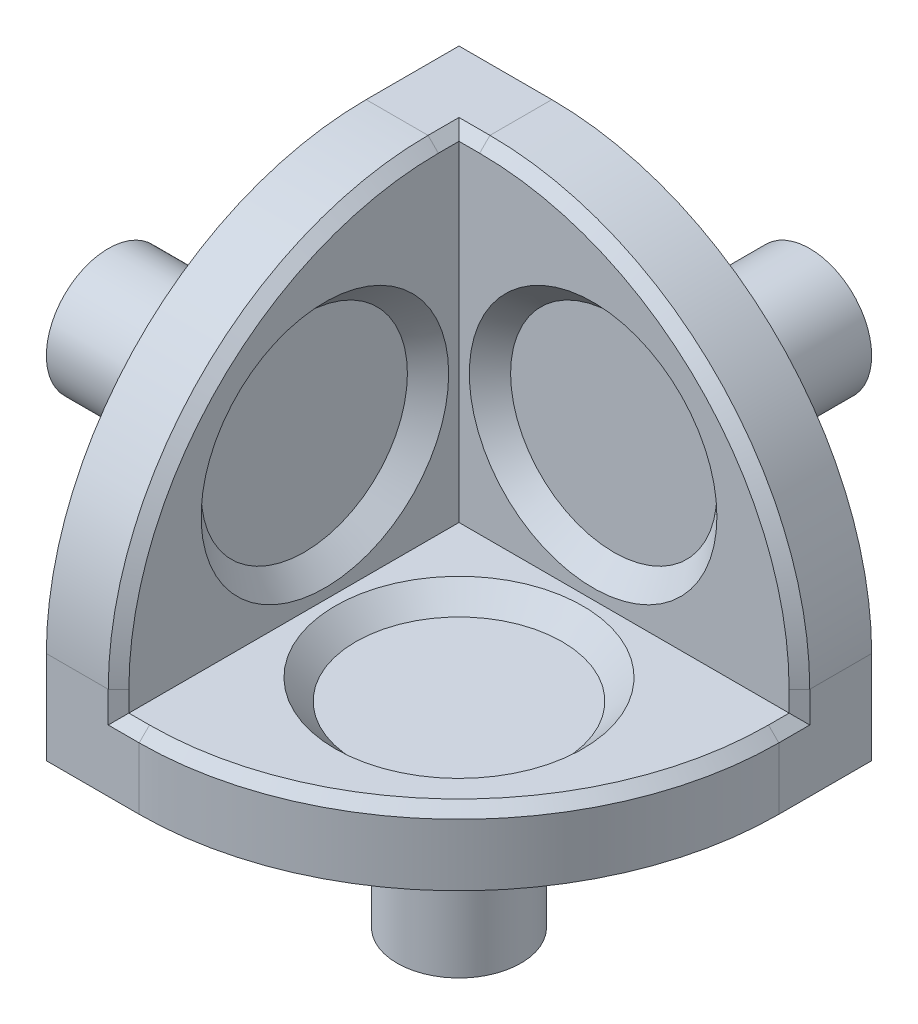
ISO-10303-21;
HEADER;
FILE_DESCRIPTION(('STEP AP214'),'2;1');
FILE_NAME('part.step','',(''),(''),'','','');
FILE_SCHEMA(('AUTOMOTIVE_DESIGN { 1 0 10303 214 1 1 1 1 }'));
ENDSEC;
DATA;
#1=APPLICATION_CONTEXT('core data for automotive mechanical design processes');
#2=APPLICATION_PROTOCOL_DEFINITION('international standard','automotive_design',2000,#1);
#3=PRODUCT_CONTEXT('',#1,'mechanical');
#4=PRODUCT('Part','Part','',(#3));
#5=PRODUCT_RELATED_PRODUCT_CATEGORY('part','',(#4));
#6=PRODUCT_DEFINITION_FORMATION('','',#4);
#7=PRODUCT_DEFINITION_CONTEXT('part definition',#1,'design');
#8=PRODUCT_DEFINITION('design','',#6,#7);
#9=PRODUCT_DEFINITION_SHAPE('','',#8);
#10=(LENGTH_UNIT() NAMED_UNIT(*) SI_UNIT(.MILLI.,.METRE.));
#11=(NAMED_UNIT(*) PLANE_ANGLE_UNIT() SI_UNIT($,.RADIAN.));
#12=(NAMED_UNIT(*) SI_UNIT($,.STERADIAN.) SOLID_ANGLE_UNIT());
#13=UNCERTAINTY_MEASURE_WITH_UNIT(LENGTH_MEASURE(1.E-05),#10,'distance_accuracy_value','');
#14=(GEOMETRIC_REPRESENTATION_CONTEXT(3) GLOBAL_UNCERTAINTY_ASSIGNED_CONTEXT((#13)) GLOBAL_UNIT_ASSIGNED_CONTEXT((#10,
#11,#12)) REPRESENTATION_CONTEXT('',''));
#15=CARTESIAN_POINT('',(0.,0.,0.));
#16=DIRECTION('',(0.,0.,1.));
#17=DIRECTION('',(1.,0.,0.));
#18=AXIS2_PLACEMENT_3D('',#15,#16,#17);
#19=CARTESIAN_POINT('',(10.,2.5,10.));
#20=DIRECTION('',(0.,1.,0.));
#21=DIRECTION('',(0.,0.,1.));
#22=AXIS2_PLACEMENT_3D('',#19,#20,#21);
#23=PLANE('',#22);
#24=CARTESIAN_POINT('',(10.,2.49999999994088,10.));
#25=DIRECTION('',(0.,1.,0.));
#26=DIRECTION('',(0.,0.,1.));
#27=AXIS2_PLACEMENT_3D('',#24,#25,#26);
#28=CIRCLE('',#27,4.9999999999719);
#29=CARTESIAN_POINT('',(10.,2.49999999994088,14.9999999999719));
#30=VERTEX_POINT('',#29);
#31=EDGE_CURVE('E19',#30,#30,#28,.T.);
#32=ORIENTED_EDGE('',*,*,#31,.T.);
#33=EDGE_LOOP('',(#32));
#34=FACE_BOUND('',#33,.T.);
#35=ADVANCED_FACE('F15',(#34),#23,.T.);
#36=CARTESIAN_POINT('',(10.,10.,2.5));
#37=DIRECTION('',(0.,0.,1.));
#38=DIRECTION('',(1.,0.,0.));
#39=AXIS2_PLACEMENT_3D('',#36,#37,#38);
#40=PLANE('',#39);
#41=CARTESIAN_POINT('',(10.,10.,2.50000000005457));
#42=DIRECTION('',(0.,0.,1.));
#43=DIRECTION('',(1.,0.,0.));
#44=AXIS2_PLACEMENT_3D('',#41,#42,#43);
#45=CIRCLE('',#44,4.99999999998636);
#46=CARTESIAN_POINT('',(14.9999999999864,10.,2.50000000005457));
#47=VERTEX_POINT('',#46);
#48=EDGE_CURVE('E345',#47,#47,#45,.T.);
#49=ORIENTED_EDGE('',*,*,#48,.T.);
#50=EDGE_LOOP('',(#49));
#51=FACE_BOUND('',#50,.T.);
#52=ADVANCED_FACE('F593',(#51),#40,.T.);
#53=CARTESIAN_POINT('',(10.,10.,-7.));
#54=DIRECTION('',(0.,0.,1.));
#55=DIRECTION('',(1.,0.,0.));
#56=AXIS2_PLACEMENT_3D('',#53,#54,#55);
#57=PLANE('',#56);
#58=CARTESIAN_POINT('',(10.,10.,-7.));
#59=DIRECTION('',(0.,0.,1.));
#60=DIRECTION('',(1.,0.,0.));
#61=AXIS2_PLACEMENT_3D('',#58,#59,#60);
#62=CIRCLE('',#61,3.);
#63=CARTESIAN_POINT('',(13.,10.,-7.));
#64=VERTEX_POINT('',#63);
#65=EDGE_CURVE('E343',#64,#64,#62,.T.);
#66=ORIENTED_EDGE('',*,*,#65,.F.);
#67=EDGE_LOOP('',(#66));
#68=FACE_BOUND('',#67,.T.);
#69=ADVANCED_FACE('F367',(#68),#57,.F.);
#70=CARTESIAN_POINT('',(10.,-7.,10.));
#71=DIRECTION('',(0.,1.,0.));
#72=DIRECTION('',(0.,0.,1.));
#73=AXIS2_PLACEMENT_3D('',#70,#71,#72);
#74=PLANE('',#73);
#75=CARTESIAN_POINT('',(10.,-7.,10.));
#76=DIRECTION('',(0.,1.,0.));
#77=DIRECTION('',(0.,0.,1.));
#78=AXIS2_PLACEMENT_3D('',#75,#76,#77);
#79=CIRCLE('',#78,3.);
#80=CARTESIAN_POINT('',(10.,-7.,13.));
#81=VERTEX_POINT('',#80);
#82=EDGE_CURVE('E340',#81,#81,#79,.T.);
#83=ORIENTED_EDGE('',*,*,#82,.F.);
#84=EDGE_LOOP('',(#83));
#85=FACE_BOUND('',#84,.T.);
#86=ADVANCED_FACE('F356',(#85),#74,.F.);
#87=CARTESIAN_POINT('',(10.,3.49999999997408,10.));
#88=DIRECTION('',(0.,1.,0.));
#89=DIRECTION('',(0.,0.,1.));
#90=AXIS2_PLACEMENT_3D('',#87,#88,#89);
#91=CONICAL_SURFACE('',#90,5.99999999997979,0.785398163384793);
#92=CARTESIAN_POINT('',(10.,3.49999999997408,10.));
#93=DIRECTION('',(0.,1.,0.));
#94=DIRECTION('',(0.,0.,1.));
#95=AXIS2_PLACEMENT_3D('',#92,#93,#94);
#96=CIRCLE('',#95,5.99999999997979);
#97=CARTESIAN_POINT('',(10.,3.49999999997408,15.9999999999798));
#98=VERTEX_POINT('',#97);
#99=EDGE_CURVE('E337',#98,#98,#96,.F.);
#100=ORIENTED_EDGE('',*,*,#99,.F.);
#101=EDGE_LOOP('',(#100));
#102=FACE_BOUND('',#101,.T.);
#103=ORIENTED_EDGE('',*,*,#31,.F.);
#104=EDGE_LOOP('',(#103));
#105=FACE_BOUND('',#104,.T.);
#106=ADVANCED_FACE('F353',(#102,#105),#91,.F.);
#107=CARTESIAN_POINT('',(2.5,10.,10.));
#108=DIRECTION('',(1.,0.,0.));
#109=DIRECTION('',(0.,0.,-1.));
#110=AXIS2_PLACEMENT_3D('',#107,#108,#109);
#111=PLANE('',#110);
#112=CARTESIAN_POINT('',(2.50000000005457,10.,10.));
#113=DIRECTION('',(1.,0.,0.));
#114=DIRECTION('',(0.,0.,-1.));
#115=AXIS2_PLACEMENT_3D('',#112,#113,#114);
#116=CIRCLE('',#115,4.99999999998636);
#117=CARTESIAN_POINT('',(2.50000000005457,10.,5.00000000001364));
#118=VERTEX_POINT('',#117);
#119=EDGE_CURVE('E334',#118,#118,#116,.T.);
#120=ORIENTED_EDGE('',*,*,#119,.T.);
#121=EDGE_LOOP('',(#120));
#122=FACE_BOUND('',#121,.T.);
#123=ADVANCED_FACE('F355',(#122),#111,.T.);
#124=CARTESIAN_POINT('',(10.,10.,3.49999999991724));
#125=DIRECTION('',(0.,0.,1.));
#126=DIRECTION('',(1.,0.,0.));
#127=AXIS2_PLACEMENT_3D('',#124,#125,#126);
#128=CONICAL_SURFACE('',#127,5.99999999984902,0.785398163397448);
#129=CARTESIAN_POINT('',(10.,10.,3.49999999997408));
#130=DIRECTION('',(0.,0.,1.));
#131=DIRECTION('',(1.,0.,0.));
#132=AXIS2_PLACEMENT_3D('',#129,#130,#131);
#133=CIRCLE('',#132,5.99999999990587);
#134=CARTESIAN_POINT('',(15.9999999999059,10.,3.49999999997408));
#135=VERTEX_POINT('',#134);
#136=EDGE_CURVE('E294',#135,#135,#133,.F.);
#137=ORIENTED_EDGE('',*,*,#136,.F.);
#138=EDGE_LOOP('',(#137));
#139=FACE_BOUND('',#138,.T.);
#140=ORIENTED_EDGE('',*,*,#48,.F.);
#141=EDGE_LOOP('',(#140));
#142=FACE_BOUND('',#141,.T.);
#143=ADVANCED_FACE('F364',(#139,#142),#128,.F.);
#144=CARTESIAN_POINT('',(10.,10.,-7.475));
#145=DIRECTION('',(0.,0.,1.));
#146=DIRECTION('',(1.,0.,0.));
#147=AXIS2_PLACEMENT_3D('',#144,#145,#146);
#148=CYLINDRICAL_SURFACE('',#147,3.);
#149=ORIENTED_EDGE('',*,*,#65,.T.);
#150=EDGE_LOOP('',(#149));
#151=FACE_BOUND('',#150,.T.);
#152=CARTESIAN_POINT('',(10.,10.,0.500000000101863));
#153=DIRECTION('',(0.,0.,1.));
#154=DIRECTION('',(0.,1.,0.));
#155=AXIS2_PLACEMENT_3D('',#152,#153,#154);
#156=CIRCLE('',#155,2.99999999997681);
#157=CARTESIAN_POINT('',(10.,12.9999999999768,0.500000000101863));
#158=VERTEX_POINT('',#157);
#159=EDGE_CURVE('E284',#158,#158,#156,.T.);
#160=ORIENTED_EDGE('',*,*,#159,.F.);
#161=EDGE_LOOP('',(#160));
#162=FACE_BOUND('',#161,.T.);
#163=ADVANCED_FACE('F681',(#151,#162),#148,.T.);
#164=CARTESIAN_POINT('',(10.,-7.475,10.));
#165=DIRECTION('',(0.,1.,0.));
#166=DIRECTION('',(0.,0.,1.));
#167=AXIS2_PLACEMENT_3D('',#164,#165,#166);
#168=CYLINDRICAL_SURFACE('',#167,3.);
#169=ORIENTED_EDGE('',*,*,#82,.T.);
#170=EDGE_LOOP('',(#169));
#171=FACE_BOUND('',#170,.T.);
#172=CARTESIAN_POINT('',(10.,0.500000000101863,10.));
#173=DIRECTION('',(0.,1.,0.));
#174=DIRECTION('',(1.,0.,0.));
#175=AXIS2_PLACEMENT_3D('',#172,#173,#174);
#176=CIRCLE('',#175,2.99999999997681);
#177=CARTESIAN_POINT('',(12.9999999999768,0.500000000101863,10.));
#178=VERTEX_POINT('',#177);
#179=EDGE_CURVE('E262',#178,#178,#176,.T.);
#180=ORIENTED_EDGE('',*,*,#179,.F.);
#181=EDGE_LOOP('',(#180));
#182=FACE_BOUND('',#181,.T.);
#183=ADVANCED_FACE('F686',(#171,#182),#168,.T.);
#184=CARTESIAN_POINT('',(0.,3.5,0.));
#185=DIRECTION('',(0.,1.,0.));
#186=DIRECTION('',(0.,0.,1.));
#187=AXIS2_PLACEMENT_3D('',#184,#185,#186);
#188=PLANE('',#187);
#189=ORIENTED_EDGE('',*,*,#99,.T.);
#190=EDGE_LOOP('',(#189));
#191=FACE_BOUND('',#190,.T.);
#192=DIRECTION('',(1.,0.,0.));
#193=VECTOR('',#192,1.);
#194=CARTESIAN_POINT('',(3.5,3.5,3.5));
#195=LINE('',#194,#193);
#196=CARTESIAN_POINT('',(3.5,3.5,3.5));
#197=VERTEX_POINT('',#196);
#198=CARTESIAN_POINT('',(19.5,3.5,3.5));
#199=VERTEX_POINT('',#198);
#200=EDGE_CURVE('E95',#197,#199,#195,.T.);
#201=ORIENTED_EDGE('',*,*,#200,.F.);
#202=DIRECTION('',(0.,0.,-1.));
#203=VECTOR('',#202,1.);
#204=CARTESIAN_POINT('',(3.5,3.5,20.));
#205=LINE('',#204,#203);
#206=CARTESIAN_POINT('',(3.5,3.5,19.5));
#207=VERTEX_POINT('',#206);
#208=EDGE_CURVE('E256',#207,#197,#205,.T.);
#209=ORIENTED_EDGE('',*,*,#208,.F.);
#210=DIRECTION('',(1.,0.,0.));
#211=VECTOR('',#210,1.);
#212=CARTESIAN_POINT('',(0.,3.5,19.5));
#213=LINE('',#212,#211);
#214=CARTESIAN_POINT('',(4.5,3.50000000000004,19.5));
#215=VERTEX_POINT('',#214);
#216=EDGE_CURVE('E102',#207,#215,#213,.T.);
#217=ORIENTED_EDGE('',*,*,#216,.T.);
#218=CARTESIAN_POINT('',(4.5,3.50000000000004,4.5));
#219=DIRECTION('',(0.,-1.,0.));
#220=DIRECTION('',(0.,0.,-1.));
#221=AXIS2_PLACEMENT_3D('',#218,#219,#220);
#222=CIRCLE('',#221,15.);
#223=CARTESIAN_POINT('',(19.5,3.50000000000004,4.5));
#224=VERTEX_POINT('',#223);
#225=EDGE_CURVE('E266',#224,#215,#222,.T.);
#226=ORIENTED_EDGE('',*,*,#225,.F.);
#227=DIRECTION('',(0.,0.,1.));
#228=VECTOR('',#227,1.);
#229=CARTESIAN_POINT('',(19.5,3.5,4.5));
#230=LINE('',#229,#228);
#231=EDGE_CURVE('E79',#224,#199,#230,.F.);
#232=ORIENTED_EDGE('',*,*,#231,.T.);
#233=EDGE_LOOP('',(#201,#209,#217,#226,#232));
#234=FACE_BOUND('',#233,.T.);
#235=ADVANCED_FACE('F441',(#191,#234),#188,.T.);
#236=CARTESIAN_POINT('',(3.49999999991724,10.,10.));
#237=DIRECTION('',(1.,0.,0.));
#238=DIRECTION('',(0.,0.,-1.));
#239=AXIS2_PLACEMENT_3D('',#236,#237,#238);
#240=CONICAL_SURFACE('',#239,5.99999999984902,0.785398163397448);
#241=CARTESIAN_POINT('',(3.49999999997408,10.,10.));
#242=DIRECTION('',(1.,0.,0.));
#243=DIRECTION('',(0.,0.,-1.));
#244=AXIS2_PLACEMENT_3D('',#241,#242,#243);
#245=CIRCLE('',#244,5.99999999990587);
#246=CARTESIAN_POINT('',(3.49999999997408,10.,4.00000000009413));
#247=VERTEX_POINT('',#246);
#248=EDGE_CURVE('E245',#247,#247,#245,.F.);
#249=ORIENTED_EDGE('',*,*,#248,.F.);
#250=EDGE_LOOP('',(#249));
#251=FACE_BOUND('',#250,.T.);
#252=ORIENTED_EDGE('',*,*,#119,.F.);
#253=EDGE_LOOP('',(#252));
#254=FACE_BOUND('',#253,.T.);
#255=ADVANCED_FACE('F515',(#251,#254),#240,.F.);
#256=CARTESIAN_POINT('',(3.5,0.,3.5));
#257=DIRECTION('',(0.,0.,1.));
#258=DIRECTION('',(1.,0.,0.));
#259=AXIS2_PLACEMENT_3D('',#256,#257,#258);
#260=PLANE('',#259);
#261=ORIENTED_EDGE('',*,*,#136,.T.);
#262=EDGE_LOOP('',(#261));
#263=FACE_BOUND('',#262,.T.);
#264=DIRECTION('',(0.,1.,0.));
#265=VECTOR('',#264,1.);
#266=CARTESIAN_POINT('',(3.5,0.,3.5));
#267=LINE('',#266,#265);
#268=CARTESIAN_POINT('',(3.5,19.5,3.5));
#269=VERTEX_POINT('',#268);
#270=EDGE_CURVE('E287',#197,#269,#267,.T.);
#271=ORIENTED_EDGE('',*,*,#270,.F.);
#272=ORIENTED_EDGE('',*,*,#200,.T.);
#273=DIRECTION('',(0.,1.,0.));
#274=VECTOR('',#273,1.);
#275=CARTESIAN_POINT('',(19.5,3.5,3.5));
#276=LINE('',#275,#274);
#277=CARTESIAN_POINT('',(19.5,4.5,3.50000000000004));
#278=VERTEX_POINT('',#277);
#279=EDGE_CURVE('E281',#278,#199,#276,.F.);
#280=ORIENTED_EDGE('',*,*,#279,.F.);
#281=CARTESIAN_POINT('',(4.5,4.5,3.50000000000004));
#282=DIRECTION('',(0.,0.,-1.));
#283=DIRECTION('',(0.,1.,0.));
#284=AXIS2_PLACEMENT_3D('',#281,#282,#283);
#285=CIRCLE('',#284,15.);
#286=CARTESIAN_POINT('',(4.5,19.5,3.50000000000002));
#287=VERTEX_POINT('',#286);
#288=EDGE_CURVE('E244',#287,#278,#285,.T.);
#289=ORIENTED_EDGE('',*,*,#288,.F.);
#290=DIRECTION('',(1.,0.,0.));
#291=VECTOR('',#290,1.);
#292=CARTESIAN_POINT('',(3.5,19.5,3.5));
#293=LINE('',#292,#291);
#294=EDGE_CURVE('E295',#287,#269,#293,.F.);
#295=ORIENTED_EDGE('',*,*,#294,.T.);
#296=EDGE_LOOP('',(#271,#272,#280,#289,#295));
#297=FACE_BOUND('',#296,.T.);
#298=ADVANCED_FACE('F457',(#263,#297),#260,.T.);
#299=CARTESIAN_POINT('',(-7.,10.,10.));
#300=DIRECTION('',(1.,0.,0.));
#301=DIRECTION('',(0.,0.,-1.));
#302=AXIS2_PLACEMENT_3D('',#299,#300,#301);
#303=PLANE('',#302);
#304=CARTESIAN_POINT('',(-7.,10.,10.));
#305=DIRECTION('',(1.,0.,0.));
#306=DIRECTION('',(0.,0.,-1.));
#307=AXIS2_PLACEMENT_3D('',#304,#305,#306);
#308=CIRCLE('',#307,3.);
#309=CARTESIAN_POINT('',(-7.,10.,7.));
#310=VERTEX_POINT('',#309);
#311=EDGE_CURVE('E280',#310,#310,#308,.T.);
#312=ORIENTED_EDGE('',*,*,#311,.F.);
#313=EDGE_LOOP('',(#312));
#314=FACE_BOUND('',#313,.T.);
#315=ADVANCED_FACE('F514',(#314),#303,.F.);
#316=CARTESIAN_POINT('',(10.,10.,0.799999999969714));
#317=DIRECTION('',(0.,0.,1.));
#318=DIRECTION('',(1.,0.,0.));
#319=AXIS2_PLACEMENT_3D('',#316,#317,#318);
#320=CONICAL_SURFACE('',#319,3.29999999984466,0.785398163302709);
#321=ORIENTED_EDGE('',*,*,#159,.T.);
#322=EDGE_LOOP('',(#321));
#323=FACE_BOUND('',#322,.T.);
#324=CARTESIAN_POINT('',(10.,10.,0.8));
#325=DIRECTION('',(0.,0.,-1.));
#326=DIRECTION('',(-1.,0.,0.));
#327=AXIS2_PLACEMENT_3D('',#324,#325,#326);
#328=CIRCLE('',#327,3.3);
#329=CARTESIAN_POINT('',(6.7,10.,0.8));
#330=VERTEX_POINT('',#329);
#331=EDGE_CURVE('E234',#330,#330,#328,.T.);
#332=ORIENTED_EDGE('',*,*,#331,.T.);
#333=EDGE_LOOP('',(#332));
#334=FACE_BOUND('',#333,.T.);
#335=ADVANCED_FACE('F644',(#323,#334),#320,.T.);
#336=CARTESIAN_POINT('',(20.,3.5,3.));
#337=DIRECTION('',(0.707106781186548,0.,0.707106781186548));
#338=DIRECTION('',(0.707106781186548,0.,-0.707106781186548));
#339=AXIS2_PLACEMENT_3D('',#336,#337,#338);
#340=PLANE('',#339);
#341=DIRECTION('',(0.577350269189626,-0.577350269189625,-0.577350269189626));
#342=VECTOR('',#341,1.);
#343=CARTESIAN_POINT('',(19.5,3.5,3.5));
#344=LINE('',#343,#342);
#345=CARTESIAN_POINT('',(20.,3.,3.));
#346=VERTEX_POINT('',#345);
#347=EDGE_CURVE('E274',#199,#346,#344,.T.);
#348=ORIENTED_EDGE('',*,*,#347,.T.);
#349=DIRECTION('',(0.,1.,0.));
#350=VECTOR('',#349,1.);
#351=CARTESIAN_POINT('',(20.,0.,3.));
#352=LINE('',#351,#350);
#353=CARTESIAN_POINT('',(20.,4.5,2.99999999999999));
#354=VERTEX_POINT('',#353);
#355=EDGE_CURVE('E230',#354,#346,#352,.F.);
#356=ORIENTED_EDGE('',*,*,#355,.F.);
#357=DIRECTION('',(-0.707106781186443,0.,0.707106781186652));
#358=VECTOR('',#357,1.);
#359=CARTESIAN_POINT('',(19.75,4.5,3.25));
#360=LINE('',#359,#358);
#361=EDGE_CURVE('E241',#278,#354,#360,.F.);
#362=ORIENTED_EDGE('',*,*,#361,.F.);
#363=ORIENTED_EDGE('',*,*,#279,.T.);
#364=EDGE_LOOP('',(#348,#356,#362,#363));
#365=FACE_BOUND('',#364,.T.);
#366=ADVANCED_FACE('F454',(#365),#340,.T.);
#367=CARTESIAN_POINT('',(19.5,3.5,4.5));
#368=DIRECTION('',(-0.707106781186548,-0.707106781186548,0.));
#369=DIRECTION('',(0.707106781186548,-0.707106781186548,0.));
#370=AXIS2_PLACEMENT_3D('',#367,#368,#369);
#371=PLANE('',#370);
#372=DIRECTION('',(0.,0.,-1.));
#373=VECTOR('',#372,1.);
#374=CARTESIAN_POINT('',(20.,3.,3.5));
#375=LINE('',#374,#373);
#376=CARTESIAN_POINT('',(20.,2.99999999999999,4.5));
#377=VERTEX_POINT('',#376);
#378=EDGE_CURVE('E233',#346,#377,#375,.F.);
#379=ORIENTED_EDGE('',*,*,#378,.F.);
#380=ORIENTED_EDGE('',*,*,#347,.F.);
#381=ORIENTED_EDGE('',*,*,#231,.F.);
#382=DIRECTION('',(-0.707106781186443,0.707106781186652,0.));
#383=VECTOR('',#382,1.);
#384=CARTESIAN_POINT('',(19.75,3.25,4.5));
#385=LINE('',#384,#383);
#386=EDGE_CURVE('E107',#377,#224,#385,.T.);
#387=ORIENTED_EDGE('',*,*,#386,.F.);
#388=EDGE_LOOP('',(#379,#380,#381,#387));
#389=FACE_BOUND('',#388,.T.);
#390=ADVANCED_FACE('F452',(#389),#371,.F.);
#391=CARTESIAN_POINT('',(10.,0.799999999969714,10.));
#392=DIRECTION('',(0.,1.,0.));
#393=DIRECTION('',(0.,0.,1.));
#394=AXIS2_PLACEMENT_3D('',#391,#392,#393);
#395=CONICAL_SURFACE('',#394,3.29999999984466,0.785398163302709);
#396=ORIENTED_EDGE('',*,*,#179,.T.);
#397=EDGE_LOOP('',(#396));
#398=FACE_BOUND('',#397,.T.);
#399=CARTESIAN_POINT('',(10.,0.8,10.));
#400=DIRECTION('',(0.,-1.,0.));
#401=DIRECTION('',(0.,0.,-1.));
#402=AXIS2_PLACEMENT_3D('',#399,#400,#401);
#403=CIRCLE('',#402,3.3);
#404=CARTESIAN_POINT('',(10.,0.8,6.7));
#405=VERTEX_POINT('',#404);
#406=EDGE_CURVE('E218',#405,#405,#403,.T.);
#407=ORIENTED_EDGE('',*,*,#406,.T.);
#408=EDGE_LOOP('',(#407));
#409=FACE_BOUND('',#408,.T.);
#410=ADVANCED_FACE('F556',(#398,#409),#395,.T.);
#411=CARTESIAN_POINT('',(4.5,2.99999999999997,4.5));
#412=DIRECTION('',(0.,-1.,0.));
#413=DIRECTION('',(0.,0.,-1.));
#414=AXIS2_PLACEMENT_3D('',#411,#412,#413);
#415=CONICAL_SURFACE('',#414,15.5,0.785398163397301);
#416=ORIENTED_EDGE('',*,*,#386,.T.);
#417=ORIENTED_EDGE('',*,*,#225,.T.);
#418=DIRECTION('',(0.,0.707106781186652,-0.707106781186443));
#419=VECTOR('',#418,1.);
#420=CARTESIAN_POINT('',(4.5,3.25,19.75));
#421=LINE('',#420,#419);
#422=CARTESIAN_POINT('',(4.5,2.99999999999999,20.));
#423=VERTEX_POINT('',#422);
#424=EDGE_CURVE('E89',#215,#423,#421,.F.);
#425=ORIENTED_EDGE('',*,*,#424,.T.);
#426=CARTESIAN_POINT('',(4.5,3.,4.5));
#427=DIRECTION('',(0.,1.,0.));
#428=DIRECTION('',(0.,0.,1.));
#429=AXIS2_PLACEMENT_3D('',#426,#427,#428);
#430=CIRCLE('',#429,15.5);
#431=EDGE_CURVE('E199',#377,#423,#430,.F.);
#432=ORIENTED_EDGE('',*,*,#431,.F.);
#433=EDGE_LOOP('',(#416,#417,#425,#432));
#434=FACE_BOUND('',#433,.T.);
#435=ADVANCED_FACE('F443',(#434),#415,.T.);
#436=CARTESIAN_POINT('',(3.5,0.,20.));
#437=DIRECTION('',(1.,0.,0.));
#438=DIRECTION('',(0.,0.,-1.));
#439=AXIS2_PLACEMENT_3D('',#436,#437,#438);
#440=PLANE('',#439);
#441=ORIENTED_EDGE('',*,*,#248,.T.);
#442=EDGE_LOOP('',(#441));
#443=FACE_BOUND('',#442,.T.);
#444=DIRECTION('',(0.,1.,0.));
#445=VECTOR('',#444,1.);
#446=CARTESIAN_POINT('',(3.5,3.5,19.5));
#447=LINE('',#446,#445);
#448=CARTESIAN_POINT('',(3.50000000000004,4.5,19.5));
#449=VERTEX_POINT('',#448);
#450=EDGE_CURVE('E188',#207,#449,#447,.T.);
#451=ORIENTED_EDGE('',*,*,#450,.F.);
#452=ORIENTED_EDGE('',*,*,#208,.T.);
#453=ORIENTED_EDGE('',*,*,#270,.T.);
#454=DIRECTION('',(0.,0.,-1.));
#455=VECTOR('',#454,1.);
#456=CARTESIAN_POINT('',(3.5,19.5,20.));
#457=LINE('',#456,#455);
#458=CARTESIAN_POINT('',(3.50000000000002,19.5,4.5));
#459=VERTEX_POINT('',#458);
#460=EDGE_CURVE('E150',#269,#459,#457,.F.);
#461=ORIENTED_EDGE('',*,*,#460,.T.);
#462=CARTESIAN_POINT('',(3.50000000000004,4.5,4.5));
#463=DIRECTION('',(-1.,0.,0.));
#464=DIRECTION('',(0.,-1.,0.));
#465=AXIS2_PLACEMENT_3D('',#462,#463,#464);
#466=CIRCLE('',#465,15.);
#467=EDGE_CURVE('E178',#449,#459,#466,.T.);
#468=ORIENTED_EDGE('',*,*,#467,.F.);
#469=EDGE_LOOP('',(#451,#452,#453,#461,#468));
#470=FACE_BOUND('',#469,.T.);
#471=ADVANCED_FACE('F624',(#443,#470),#440,.T.);
#472=CARTESIAN_POINT('',(4.5,4.5,2.99999999999997));
#473=DIRECTION('',(0.,0.,-1.));
#474=DIRECTION('',(0.,1.,0.));
#475=AXIS2_PLACEMENT_3D('',#472,#473,#474);
#476=CONICAL_SURFACE('',#475,15.5,0.785398163397301);
#477=DIRECTION('',(0.,0.707106781186548,-0.707106781186548));
#478=VECTOR('',#477,1.);
#479=CARTESIAN_POINT('',(4.5,20.,3.));
#480=LINE('',#479,#478);
#481=CARTESIAN_POINT('',(4.5,20.,3.));
#482=VERTEX_POINT('',#481);
#483=EDGE_CURVE('E154',#482,#287,#480,.F.);
#484=ORIENTED_EDGE('',*,*,#483,.T.);
#485=ORIENTED_EDGE('',*,*,#288,.T.);
#486=ORIENTED_EDGE('',*,*,#361,.T.);
#487=CARTESIAN_POINT('',(4.5,4.5,3.));
#488=DIRECTION('',(0.,0.,1.));
#489=DIRECTION('',(1.,0.,0.));
#490=AXIS2_PLACEMENT_3D('',#487,#488,#489);
#491=CIRCLE('',#490,15.5);
#492=EDGE_CURVE('E153',#482,#354,#491,.F.);
#493=ORIENTED_EDGE('',*,*,#492,.F.);
#494=EDGE_LOOP('',(#484,#485,#486,#493));
#495=FACE_BOUND('',#494,.T.);
#496=ADVANCED_FACE('F459',(#495),#476,.T.);
#497=CARTESIAN_POINT('',(-7.475,10.,10.));
#498=DIRECTION('',(1.,0.,0.));
#499=DIRECTION('',(0.,0.,-1.));
#500=AXIS2_PLACEMENT_3D('',#497,#498,#499);
#501=CYLINDRICAL_SURFACE('',#500,3.);
#502=ORIENTED_EDGE('',*,*,#311,.T.);
#503=EDGE_LOOP('',(#502));
#504=FACE_BOUND('',#503,.T.);
#505=CARTESIAN_POINT('',(0.50000000004502,10.,10.));
#506=DIRECTION('',(1.,0.,0.));
#507=DIRECTION('',(0.,-1.,0.));
#508=AXIS2_PLACEMENT_3D('',#505,#506,#507);
#509=CIRCLE('',#508,3.00000000005184);
#510=CARTESIAN_POINT('',(0.50000000004502,6.99999999994816,10.));
#511=VERTEX_POINT('',#510);
#512=EDGE_CURVE('E224',#511,#511,#509,.T.);
#513=ORIENTED_EDGE('',*,*,#512,.F.);
#514=EDGE_LOOP('',(#513));
#515=FACE_BOUND('',#514,.T.);
#516=ADVANCED_FACE('F571',(#504,#515),#501,.T.);
#517=CARTESIAN_POINT('',(10.,10.,3.675));
#518=DIRECTION('',(0.,0.,-1.));
#519=DIRECTION('',(-1.,0.,0.));
#520=AXIS2_PLACEMENT_3D('',#517,#518,#519);
#521=CYLINDRICAL_SURFACE('',#520,3.3);
#522=ORIENTED_EDGE('',*,*,#331,.F.);
#523=EDGE_LOOP('',(#522));
#524=FACE_BOUND('',#523,.T.);
#525=CARTESIAN_POINT('',(10.,10.,0.));
#526=DIRECTION('',(0.,0.,-1.));
#527=DIRECTION('',(-1.,0.,0.));
#528=AXIS2_PLACEMENT_3D('',#525,#526,#527);
#529=CIRCLE('',#528,3.3);
#530=CARTESIAN_POINT('',(6.7,10.,0.));
#531=VERTEX_POINT('',#530);
#532=EDGE_CURVE('E317',#531,#531,#529,.F.);
#533=ORIENTED_EDGE('',*,*,#532,.F.);
#534=EDGE_LOOP('',(#533));
#535=FACE_BOUND('',#534,.T.);
#536=ADVANCED_FACE('F566',(#524,#535),#521,.F.);
#537=CARTESIAN_POINT('',(20.,0.,3.5));
#538=DIRECTION('',(1.,0.,0.));
#539=DIRECTION('',(0.,0.,-1.));
#540=AXIS2_PLACEMENT_3D('',#537,#538,#539);
#541=PLANE('',#540);
#542=DIRECTION('',(0.,1.,0.));
#543=VECTOR('',#542,1.);
#544=CARTESIAN_POINT('',(20.,0.,4.5));
#545=LINE('',#544,#543);
#546=CARTESIAN_POINT('',(20.,0.,4.5));
#547=VERTEX_POINT('',#546);
#548=EDGE_CURVE('E213',#547,#377,#545,.T.);
#549=ORIENTED_EDGE('',*,*,#548,.F.);
#550=DIRECTION('',(0.,0.,1.));
#551=VECTOR('',#550,1.);
#552=CARTESIAN_POINT('',(20.,0.,0.));
#553=LINE('',#552,#551);
#554=CARTESIAN_POINT('',(20.,0.,0.));
#555=VERTEX_POINT('',#554);
#556=EDGE_CURVE('E316',#547,#555,#553,.F.);
#557=ORIENTED_EDGE('',*,*,#556,.T.);
#558=DIRECTION('',(0.,1.,0.));
#559=VECTOR('',#558,1.);
#560=CARTESIAN_POINT('',(20.,0.,0.));
#561=LINE('',#560,#559);
#562=CARTESIAN_POINT('',(20.,4.5,0.));
#563=VERTEX_POINT('',#562);
#564=EDGE_CURVE('E229',#563,#555,#561,.F.);
#565=ORIENTED_EDGE('',*,*,#564,.F.);
#566=DIRECTION('',(0.,0.,1.));
#567=VECTOR('',#566,1.);
#568=CARTESIAN_POINT('',(20.,4.5,3.5));
#569=LINE('',#568,#567);
#570=EDGE_CURVE('E221',#354,#563,#569,.F.);
#571=ORIENTED_EDGE('',*,*,#570,.F.);
#572=ORIENTED_EDGE('',*,*,#355,.T.);
#573=ORIENTED_EDGE('',*,*,#378,.T.);
#574=EDGE_LOOP('',(#549,#557,#565,#571,#572,#573));
#575=FACE_BOUND('',#574,.T.);
#576=ADVANCED_FACE('F449',(#575),#541,.T.);
#577=CARTESIAN_POINT('',(10.,3.675,10.));
#578=DIRECTION('',(0.,-1.,0.));
#579=DIRECTION('',(0.,0.,-1.));
#580=AXIS2_PLACEMENT_3D('',#577,#578,#579);
#581=CYLINDRICAL_SURFACE('',#580,3.3);
#582=CARTESIAN_POINT('',(10.,0.,10.));
#583=DIRECTION('',(0.,-1.,0.));
#584=DIRECTION('',(0.,0.,-1.));
#585=AXIS2_PLACEMENT_3D('',#582,#583,#584);
#586=CIRCLE('',#585,3.3);
#587=CARTESIAN_POINT('',(10.,0.,6.7));
#588=VERTEX_POINT('',#587);
#589=EDGE_CURVE('E309',#588,#588,#586,.T.);
#590=ORIENTED_EDGE('',*,*,#589,.T.);
#591=EDGE_LOOP('',(#590));
#592=FACE_BOUND('',#591,.T.);
#593=ORIENTED_EDGE('',*,*,#406,.F.);
#594=EDGE_LOOP('',(#593));
#595=FACE_BOUND('',#594,.T.);
#596=ADVANCED_FACE('F710',(#592,#595),#581,.F.);
#597=CARTESIAN_POINT('',(4.5,0.,4.5));
#598=DIRECTION('',(0.,1.,0.));
#599=DIRECTION('',(0.,0.,1.));
#600=AXIS2_PLACEMENT_3D('',#597,#598,#599);
#601=CYLINDRICAL_SURFACE('',#600,15.5);
#602=DIRECTION('',(0.,1.,0.));
#603=VECTOR('',#602,1.);
#604=CARTESIAN_POINT('',(4.5,0.,20.));
#605=LINE('',#604,#603);
#606=CARTESIAN_POINT('',(4.5,0.,20.));
#607=VERTEX_POINT('',#606);
#608=EDGE_CURVE('E204',#607,#423,#605,.T.);
#609=ORIENTED_EDGE('',*,*,#608,.F.);
#610=CARTESIAN_POINT('',(4.5,0.,4.5));
#611=DIRECTION('',(0.,1.,0.));
#612=DIRECTION('',(0.,0.,1.));
#613=AXIS2_PLACEMENT_3D('',#610,#611,#612);
#614=CIRCLE('',#613,15.5);
#615=EDGE_CURVE('E313',#607,#547,#614,.T.);
#616=ORIENTED_EDGE('',*,*,#615,.T.);
#617=ORIENTED_EDGE('',*,*,#548,.T.);
#618=ORIENTED_EDGE('',*,*,#431,.T.);
#619=EDGE_LOOP('',(#609,#616,#617,#618));
#620=FACE_BOUND('',#619,.T.);
#621=ADVANCED_FACE('F446',(#620),#601,.T.);
#622=CARTESIAN_POINT('',(3.5,3.5,19.5));
#623=DIRECTION('',(0.,-0.707106781186548,-0.707106781186548));
#624=DIRECTION('',(0.,0.707106781186548,-0.707106781186548));
#625=AXIS2_PLACEMENT_3D('',#622,#623,#624);
#626=PLANE('',#625);
#627=DIRECTION('',(1.,0.,0.));
#628=VECTOR('',#627,1.);
#629=CARTESIAN_POINT('',(0.,3.,20.));
#630=LINE('',#629,#628);
#631=CARTESIAN_POINT('',(3.,3.,20.));
#632=VERTEX_POINT('',#631);
#633=EDGE_CURVE('E195',#423,#632,#630,.F.);
#634=ORIENTED_EDGE('',*,*,#633,.F.);
#635=ORIENTED_EDGE('',*,*,#424,.F.);
#636=ORIENTED_EDGE('',*,*,#216,.F.);
#637=DIRECTION('',(0.577350269189626,0.577350269189626,-0.577350269189626));
#638=VECTOR('',#637,1.);
#639=CARTESIAN_POINT('',(3.,3.,20.));
#640=LINE('',#639,#638);
#641=EDGE_CURVE('E118',#632,#207,#640,.T.);
#642=ORIENTED_EDGE('',*,*,#641,.F.);
#643=EDGE_LOOP('',(#634,#635,#636,#642));
#644=FACE_BOUND('',#643,.T.);
#645=ADVANCED_FACE('F709',(#644),#626,.F.);
#646=CARTESIAN_POINT('',(3.5,3.5,19.5));
#647=DIRECTION('',(0.707106781186548,0.,0.707106781186548));
#648=DIRECTION('',(0.707106781186548,0.,-0.707106781186548));
#649=AXIS2_PLACEMENT_3D('',#646,#647,#648);
#650=PLANE('',#649);
#651=ORIENTED_EDGE('',*,*,#641,.T.);
#652=ORIENTED_EDGE('',*,*,#450,.T.);
#653=DIRECTION('',(0.707106781186652,0.,-0.707106781186443));
#654=VECTOR('',#653,1.);
#655=CARTESIAN_POINT('',(3.25,4.5,19.75));
#656=LINE('',#655,#654);
#657=CARTESIAN_POINT('',(2.99999999999999,4.5,20.));
#658=VERTEX_POINT('',#657);
#659=EDGE_CURVE('E185',#658,#449,#656,.T.);
#660=ORIENTED_EDGE('',*,*,#659,.F.);
#661=DIRECTION('',(0.,1.,0.));
#662=VECTOR('',#661,1.);
#663=CARTESIAN_POINT('',(3.,0.,20.));
#664=LINE('',#663,#662);
#665=EDGE_CURVE('E191',#632,#658,#664,.T.);
#666=ORIENTED_EDGE('',*,*,#665,.F.);
#667=EDGE_LOOP('',(#651,#652,#660,#666));
#668=FACE_BOUND('',#667,.T.);
#669=ADVANCED_FACE('F505',(#668),#650,.T.);
#670=CARTESIAN_POINT('',(2.99999999999997,4.5,4.5));
#671=DIRECTION('',(-1.,0.,0.));
#672=DIRECTION('',(0.,-1.,0.));
#673=AXIS2_PLACEMENT_3D('',#670,#671,#672);
#674=CONICAL_SURFACE('',#673,15.5,0.785398163397301);
#675=ORIENTED_EDGE('',*,*,#659,.T.);
#676=ORIENTED_EDGE('',*,*,#467,.T.);
#677=DIRECTION('',(0.707106781186548,-0.707106781186548,0.));
#678=VECTOR('',#677,1.);
#679=CARTESIAN_POINT('',(3.,20.,4.5));
#680=LINE('',#679,#678);
#681=CARTESIAN_POINT('',(3.,20.,4.5));
#682=VERTEX_POINT('',#681);
#683=EDGE_CURVE('E176',#459,#682,#680,.F.);
#684=ORIENTED_EDGE('',*,*,#683,.T.);
#685=CARTESIAN_POINT('',(3.,4.5,4.5));
#686=DIRECTION('',(1.,0.,0.));
#687=DIRECTION('',(0.,0.,-1.));
#688=AXIS2_PLACEMENT_3D('',#685,#686,#687);
#689=CIRCLE('',#688,15.5);
#690=EDGE_CURVE('E388',#658,#682,#689,.F.);
#691=ORIENTED_EDGE('',*,*,#690,.F.);
#692=EDGE_LOOP('',(#675,#676,#684,#691));
#693=FACE_BOUND('',#692,.T.);
#694=ADVANCED_FACE('F632',(#693),#674,.T.);
#695=CARTESIAN_POINT('',(3.,20.,4.5));
#696=DIRECTION('',(-0.707106781186548,-0.707106781186548,0.));
#697=DIRECTION('',(0.707106781186548,-0.707106781186548,0.));
#698=AXIS2_PLACEMENT_3D('',#695,#696,#697);
#699=PLANE('',#698);
#700=ORIENTED_EDGE('',*,*,#460,.F.);
#701=DIRECTION('',(-0.577350269189626,0.577350269189626,-0.577350269189626));
#702=VECTOR('',#701,1.);
#703=CARTESIAN_POINT('',(3.5,19.5,3.5));
#704=LINE('',#703,#702);
#705=CARTESIAN_POINT('',(3.,20.,3.));
#706=VERTEX_POINT('',#705);
#707=EDGE_CURVE('E144',#269,#706,#704,.T.);
#708=ORIENTED_EDGE('',*,*,#707,.T.);
#709=DIRECTION('',(0.,0.,1.));
#710=VECTOR('',#709,1.);
#711=CARTESIAN_POINT('',(3.,20.,0.));
#712=LINE('',#711,#710);
#713=EDGE_CURVE('E149',#682,#706,#712,.F.);
#714=ORIENTED_EDGE('',*,*,#713,.F.);
#715=ORIENTED_EDGE('',*,*,#683,.F.);
#716=EDGE_LOOP('',(#700,#708,#714,#715));
#717=FACE_BOUND('',#716,.T.);
#718=ADVANCED_FACE('F146',(#717),#699,.F.);
#719=CARTESIAN_POINT('',(3.5,20.,3.));
#720=DIRECTION('',(0.,-0.707106781186548,-0.707106781186548));
#721=DIRECTION('',(0.,0.707106781186548,-0.707106781186548));
#722=AXIS2_PLACEMENT_3D('',#719,#720,#721);
#723=PLANE('',#722);
#724=ORIENTED_EDGE('',*,*,#294,.F.);
#725=ORIENTED_EDGE('',*,*,#483,.F.);
#726=DIRECTION('',(1.,0.,0.));
#727=VECTOR('',#726,1.);
#728=CARTESIAN_POINT('',(0.,20.,3.));
#729=LINE('',#728,#727);
#730=EDGE_CURVE('E158',#706,#482,#729,.T.);
#731=ORIENTED_EDGE('',*,*,#730,.F.);
#732=ORIENTED_EDGE('',*,*,#707,.F.);
#733=EDGE_LOOP('',(#724,#725,#731,#732));
#734=FACE_BOUND('',#733,.T.);
#735=ADVANCED_FACE('F159',(#734),#723,.F.);
#736=CARTESIAN_POINT('',(4.5,4.5,3.5));
#737=DIRECTION('',(0.,0.,1.));
#738=DIRECTION('',(1.,0.,0.));
#739=AXIS2_PLACEMENT_3D('',#736,#737,#738);
#740=CYLINDRICAL_SURFACE('',#739,15.5);
#741=CARTESIAN_POINT('',(4.5,4.5,0.));
#742=DIRECTION('',(0.,0.,1.));
#743=DIRECTION('',(1.,0.,0.));
#744=AXIS2_PLACEMENT_3D('',#741,#742,#743);
#745=CIRCLE('',#744,15.5);
#746=CARTESIAN_POINT('',(4.5,20.,0.));
#747=VERTEX_POINT('',#746);
#748=EDGE_CURVE('E320',#747,#563,#745,.F.);
#749=ORIENTED_EDGE('',*,*,#748,.F.);
#750=DIRECTION('',(0.,0.,1.));
#751=VECTOR('',#750,1.);
#752=CARTESIAN_POINT('',(4.5,20.,0.));
#753=LINE('',#752,#751);
#754=EDGE_CURVE('E164',#482,#747,#753,.F.);
#755=ORIENTED_EDGE('',*,*,#754,.F.);
#756=ORIENTED_EDGE('',*,*,#492,.T.);
#757=ORIENTED_EDGE('',*,*,#570,.T.);
#758=EDGE_LOOP('',(#749,#755,#756,#757));
#759=FACE_BOUND('',#758,.T.);
#760=ADVANCED_FACE('F461',(#759),#740,.T.);
#761=CARTESIAN_POINT('',(0.799999999969714,10.,10.));
#762=DIRECTION('',(1.,0.,0.));
#763=DIRECTION('',(0.,0.,-1.));
#764=AXIS2_PLACEMENT_3D('',#761,#762,#763);
#765=CONICAL_SURFACE('',#764,3.29999999991969,0.785398163302709);
#766=ORIENTED_EDGE('',*,*,#512,.T.);
#767=EDGE_LOOP('',(#766));
#768=FACE_BOUND('',#767,.T.);
#769=CARTESIAN_POINT('',(0.8,10.,10.));
#770=DIRECTION('',(-1.,0.,0.));
#771=DIRECTION('',(0.,0.,1.));
#772=AXIS2_PLACEMENT_3D('',#769,#770,#771);
#773=CIRCLE('',#772,3.3);
#774=CARTESIAN_POINT('',(0.8,10.,13.3));
#775=VERTEX_POINT('',#774);
#776=EDGE_CURVE('E182',#775,#775,#773,.T.);
#777=ORIENTED_EDGE('',*,*,#776,.T.);
#778=EDGE_LOOP('',(#777));
#779=FACE_BOUND('',#778,.T.);
#780=ADVANCED_FACE('F539',(#768,#779),#765,.T.);
#781=CARTESIAN_POINT('',(20.,0.,0.));
#782=DIRECTION('',(0.,0.,-1.));
#783=DIRECTION('',(-1.,0.,0.));
#784=AXIS2_PLACEMENT_3D('',#781,#782,#783);
#785=PLANE('',#784);
#786=ORIENTED_EDGE('',*,*,#532,.T.);
#787=EDGE_LOOP('',(#786));
#788=FACE_BOUND('',#787,.T.);
#789=DIRECTION('',(1.,0.,0.));
#790=VECTOR('',#789,1.);
#791=CARTESIAN_POINT('',(0.,20.,0.));
#792=LINE('',#791,#790);
#793=CARTESIAN_POINT('',(0.,20.,0.));
#794=VERTEX_POINT('',#793);
#795=EDGE_CURVE('E168',#747,#794,#792,.F.);
#796=ORIENTED_EDGE('',*,*,#795,.F.);
#797=ORIENTED_EDGE('',*,*,#748,.T.);
#798=ORIENTED_EDGE('',*,*,#564,.T.);
#799=DIRECTION('',(1.,0.,0.));
#800=VECTOR('',#799,1.);
#801=CARTESIAN_POINT('',(0.,0.,0.));
#802=LINE('',#801,#800);
#803=CARTESIAN_POINT('',(0.,0.,0.));
#804=VERTEX_POINT('',#803);
#805=EDGE_CURVE('E312',#555,#804,#802,.F.);
#806=ORIENTED_EDGE('',*,*,#805,.T.);
#807=DIRECTION('',(0.,1.,0.));
#808=VECTOR('',#807,1.);
#809=CARTESIAN_POINT('',(0.,0.,0.));
#810=LINE('',#809,#808);
#811=EDGE_CURVE('E403',#794,#804,#810,.F.);
#812=ORIENTED_EDGE('',*,*,#811,.F.);
#813=EDGE_LOOP('',(#796,#797,#798,#806,#812));
#814=FACE_BOUND('',#813,.T.);
#815=ADVANCED_FACE('F464',(#788,#814),#785,.T.);
#816=CARTESIAN_POINT('',(0.,0.,0.));
#817=DIRECTION('',(0.,1.,0.));
#818=DIRECTION('',(0.,0.,1.));
#819=AXIS2_PLACEMENT_3D('',#816,#817,#818);
#820=PLANE('',#819);
#821=ORIENTED_EDGE('',*,*,#589,.F.);
#822=EDGE_LOOP('',(#821));
#823=FACE_BOUND('',#822,.T.);
#824=ORIENTED_EDGE('',*,*,#805,.F.);
#825=ORIENTED_EDGE('',*,*,#556,.F.);
#826=ORIENTED_EDGE('',*,*,#615,.F.);
#827=DIRECTION('',(1.,0.,0.));
#828=VECTOR('',#827,1.);
#829=CARTESIAN_POINT('',(0.,0.,20.));
#830=LINE('',#829,#828);
#831=CARTESIAN_POINT('',(0.,0.,20.));
#832=VERTEX_POINT('',#831);
#833=EDGE_CURVE('E209',#832,#607,#830,.T.);
#834=ORIENTED_EDGE('',*,*,#833,.F.);
#835=DIRECTION('',(0.,0.,1.));
#836=VECTOR('',#835,1.);
#837=CARTESIAN_POINT('',(0.,0.,0.));
#838=LINE('',#837,#836);
#839=EDGE_CURVE('E401',#804,#832,#838,.T.);
#840=ORIENTED_EDGE('',*,*,#839,.F.);
#841=EDGE_LOOP('',(#824,#825,#826,#834,#840));
#842=FACE_BOUND('',#841,.T.);
#843=ADVANCED_FACE('F468',(#823,#842),#820,.F.);
#844=CARTESIAN_POINT('',(0.,0.,20.));
#845=DIRECTION('',(0.,0.,1.));
#846=DIRECTION('',(1.,0.,0.));
#847=AXIS2_PLACEMENT_3D('',#844,#845,#846);
#848=PLANE('',#847);
#849=ORIENTED_EDGE('',*,*,#633,.T.);
#850=ORIENTED_EDGE('',*,*,#665,.T.);
#851=DIRECTION('',(1.,0.,0.));
#852=VECTOR('',#851,1.);
#853=CARTESIAN_POINT('',(3.5,4.5,20.));
#854=LINE('',#853,#852);
#855=CARTESIAN_POINT('',(0.,4.5,20.));
#856=VERTEX_POINT('',#855);
#857=EDGE_CURVE('E194',#856,#658,#854,.T.);
#858=ORIENTED_EDGE('',*,*,#857,.F.);
#859=DIRECTION('',(0.,1.,0.));
#860=VECTOR('',#859,1.);
#861=CARTESIAN_POINT('',(0.,0.,20.));
#862=LINE('',#861,#860);
#863=EDGE_CURVE('E308',#832,#856,#862,.T.);
#864=ORIENTED_EDGE('',*,*,#863,.F.);
#865=ORIENTED_EDGE('',*,*,#833,.T.);
#866=ORIENTED_EDGE('',*,*,#608,.T.);
#867=EDGE_LOOP('',(#849,#850,#858,#864,#865,#866));
#868=FACE_BOUND('',#867,.T.);
#869=ADVANCED_FACE('F469',(#868),#848,.T.);
#870=CARTESIAN_POINT('',(3.5,4.5,4.5));
#871=DIRECTION('',(1.,0.,0.));
#872=DIRECTION('',(0.,0.,-1.));
#873=AXIS2_PLACEMENT_3D('',#870,#871,#872);
#874=CYLINDRICAL_SURFACE('',#873,15.5);
#875=ORIENTED_EDGE('',*,*,#690,.T.);
#876=DIRECTION('',(1.,0.,0.));
#877=VECTOR('',#876,1.);
#878=CARTESIAN_POINT('',(0.,20.,4.5));
#879=LINE('',#878,#877);
#880=CARTESIAN_POINT('',(0.,20.,4.5));
#881=VERTEX_POINT('',#880);
#882=EDGE_CURVE('E34',#881,#682,#879,.T.);
#883=ORIENTED_EDGE('',*,*,#882,.F.);
#884=CARTESIAN_POINT('',(0.,4.5,4.5));
#885=DIRECTION('',(1.,0.,0.));
#886=DIRECTION('',(0.,0.,-1.));
#887=AXIS2_PLACEMENT_3D('',#884,#885,#886);
#888=CIRCLE('',#887,15.5);
#889=EDGE_CURVE('E305',#856,#881,#888,.F.);
#890=ORIENTED_EDGE('',*,*,#889,.F.);
#891=ORIENTED_EDGE('',*,*,#857,.T.);
#892=EDGE_LOOP('',(#875,#883,#890,#891));
#893=FACE_BOUND('',#892,.T.);
#894=ADVANCED_FACE('F386',(#893),#874,.T.);
#895=CARTESIAN_POINT('',(0.,20.,0.));
#896=DIRECTION('',(0.,1.,0.));
#897=DIRECTION('',(0.,0.,1.));
#898=AXIS2_PLACEMENT_3D('',#895,#896,#897);
#899=PLANE('',#898);
#900=ORIENTED_EDGE('',*,*,#730,.T.);
#901=ORIENTED_EDGE('',*,*,#754,.T.);
#902=ORIENTED_EDGE('',*,*,#795,.T.);
#903=DIRECTION('',(0.,0.,1.));
#904=VECTOR('',#903,1.);
#905=CARTESIAN_POINT('',(0.,20.,0.));
#906=LINE('',#905,#904);
#907=EDGE_CURVE('E25',#881,#794,#906,.F.);
#908=ORIENTED_EDGE('',*,*,#907,.F.);
#909=ORIENTED_EDGE('',*,*,#882,.T.);
#910=ORIENTED_EDGE('',*,*,#713,.T.);
#911=EDGE_LOOP('',(#900,#901,#902,#908,#909,#910));
#912=FACE_BOUND('',#911,.T.);
#913=ADVANCED_FACE('F166',(#912),#899,.T.);
#914=CARTESIAN_POINT('',(3.675,10.,10.));
#915=DIRECTION('',(-1.,0.,0.));
#916=DIRECTION('',(0.,0.,1.));
#917=AXIS2_PLACEMENT_3D('',#914,#915,#916);
#918=CYLINDRICAL_SURFACE('',#917,3.3);
#919=CARTESIAN_POINT('',(0.,10.,10.));
#920=DIRECTION('',(-1.,0.,0.));
#921=DIRECTION('',(0.,0.,1.));
#922=AXIS2_PLACEMENT_3D('',#919,#920,#921);
#923=CIRCLE('',#922,3.3);
#924=CARTESIAN_POINT('',(0.,10.,13.3));
#925=VERTEX_POINT('',#924);
#926=EDGE_CURVE('E9',#925,#925,#923,.F.);
#927=ORIENTED_EDGE('',*,*,#926,.F.);
#928=EDGE_LOOP('',(#927));
#929=FACE_BOUND('',#928,.T.);
#930=ORIENTED_EDGE('',*,*,#776,.F.);
#931=EDGE_LOOP('',(#930));
#932=FACE_BOUND('',#931,.T.);
#933=ADVANCED_FACE('F372',(#929,#932),#918,.F.);
#934=CARTESIAN_POINT('',(0.,0.,0.));
#935=DIRECTION('',(-1.,0.,0.));
#936=DIRECTION('',(0.,0.,1.));
#937=AXIS2_PLACEMENT_3D('',#934,#935,#936);
#938=PLANE('',#937);
#939=ORIENTED_EDGE('',*,*,#926,.T.);
#940=EDGE_LOOP('',(#939));
#941=FACE_BOUND('',#940,.T.);
#942=ORIENTED_EDGE('',*,*,#889,.T.);
#943=ORIENTED_EDGE('',*,*,#907,.T.);
#944=ORIENTED_EDGE('',*,*,#811,.T.);
#945=ORIENTED_EDGE('',*,*,#839,.T.);
#946=ORIENTED_EDGE('',*,*,#863,.T.);
#947=EDGE_LOOP('',(#942,#943,#944,#945,#946));
#948=FACE_BOUND('',#947,.T.);
#949=ADVANCED_FACE('F17',(#941,#948),#938,.T.);
#950=CLOSED_SHELL('',(#35,#52,#69,#86,#106,#123,#143,#163,#183,#235,#255,#298,#315,#335,#366,
#390,#410,#435,#471,#496,#516,#536,#576,#596,#621,#645,#669,#694,#718,#735,#760,#780,#815,#843,
#869,#894,#913,#933,#949));
#951=MANIFOLD_SOLID_BREP('B1',#950);
#952=ADVANCED_BREP_SHAPE_REPRESENTATION('',(#18,#951),#14);
#953=SHAPE_DEFINITION_REPRESENTATION(#9,#952);
ENDSEC;
END-ISO-10303-21;
